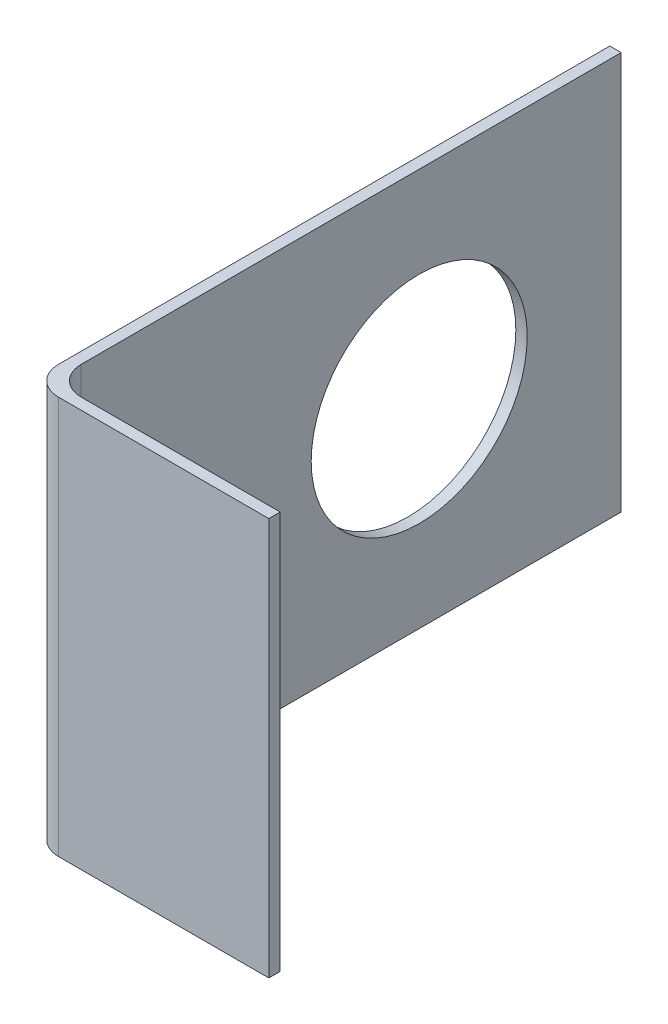
ISO-10303-21;
HEADER;
FILE_DESCRIPTION(('STEP AP214'),'2;1');
FILE_NAME('part.step','',(''),(''),'','','');
FILE_SCHEMA(('AUTOMOTIVE_DESIGN { 1 0 10303 214 1 1 1 1 }'));
ENDSEC;
DATA;
#1=APPLICATION_CONTEXT('core data for automotive mechanical design processes');
#2=APPLICATION_PROTOCOL_DEFINITION('international standard','automotive_design',2000,#1);
#3=PRODUCT_CONTEXT('',#1,'mechanical');
#4=PRODUCT('Part','Part','',(#3));
#5=PRODUCT_RELATED_PRODUCT_CATEGORY('part','',(#4));
#6=PRODUCT_DEFINITION_FORMATION('','',#4);
#7=PRODUCT_DEFINITION_CONTEXT('part definition',#1,'design');
#8=PRODUCT_DEFINITION('design','',#6,#7);
#9=PRODUCT_DEFINITION_SHAPE('','',#8);
#10=(LENGTH_UNIT() NAMED_UNIT(*) SI_UNIT(.MILLI.,.METRE.));
#11=(NAMED_UNIT(*) PLANE_ANGLE_UNIT() SI_UNIT($,.RADIAN.));
#12=(NAMED_UNIT(*) SI_UNIT($,.STERADIAN.) SOLID_ANGLE_UNIT());
#13=UNCERTAINTY_MEASURE_WITH_UNIT(LENGTH_MEASURE(1.E-05),#10,'distance_accuracy_value','');
#14=(GEOMETRIC_REPRESENTATION_CONTEXT(3) GLOBAL_UNCERTAINTY_ASSIGNED_CONTEXT((#13)) GLOBAL_UNIT_ASSIGNED_CONTEXT((#10,
#11,#12)) REPRESENTATION_CONTEXT('',''));
#15=CARTESIAN_POINT('',(0.,0.,0.));
#16=DIRECTION('',(0.,0.,1.));
#17=DIRECTION('',(1.,0.,0.));
#18=AXIS2_PLACEMENT_3D('',#15,#16,#17);
#19=CARTESIAN_POINT('',(-37.2906864976982,70.,70.6439393939394));
#20=DIRECTION('',(1.,0.,0.));
#21=DIRECTION('',(0.,0.,-1.));
#22=AXIS2_PLACEMENT_3D('',#19,#20,#21);
#23=PLANE('',#22);
#24=CARTESIAN_POINT('',(-37.2906864976982,35.,4.18393939393937));
#25=DIRECTION('',(-1.,0.,0.));
#26=DIRECTION('',(0.,0.,1.));
#27=AXIS2_PLACEMENT_3D('',#24,#25,#26);
#28=CIRCLE('',#27,19.);
#29=CARTESIAN_POINT('',(-37.2906864976982,35.,23.1839393939394));
#30=VERTEX_POINT('',#29);
#31=EDGE_CURVE('E153',#30,#30,#28,.T.);
#32=ORIENTED_EDGE('',*,*,#31,.F.);
#33=EDGE_LOOP('',(#32));
#34=FACE_BOUND('',#33,.T.);
#35=DIRECTION('',(0.,0.,1.));
#36=VECTOR('',#35,1.);
#37=CARTESIAN_POINT('',(-37.2906864976982,0.,70.6439393939394));
#38=LINE('',#37,#36);
#39=CARTESIAN_POINT('',(-37.2906864976982,0.,-31.3560606060606));
#40=VERTEX_POINT('',#39);
#41=CARTESIAN_POINT('',(-37.2906864976982,0.,65.6439393939394));
#42=VERTEX_POINT('',#41);
#43=EDGE_CURVE('E132',#40,#42,#38,.T.);
#44=ORIENTED_EDGE('',*,*,#43,.T.);
#45=DIRECTION('',(0.,-1.,0.));
#46=VECTOR('',#45,1.);
#47=CARTESIAN_POINT('',(-37.2906864976982,70.,65.6439393939394));
#48=LINE('',#47,#46);
#49=CARTESIAN_POINT('',(-37.2906864976982,70.,65.6439393939394));
#50=VERTEX_POINT('',#49);
#51=EDGE_CURVE('E157',#42,#50,#48,.F.);
#52=ORIENTED_EDGE('',*,*,#51,.T.);
#53=DIRECTION('',(0.,0.,1.));
#54=VECTOR('',#53,1.);
#55=CARTESIAN_POINT('',(-37.2906864976982,70.,70.6439393939394));
#56=LINE('',#55,#54);
#57=CARTESIAN_POINT('',(-37.2906864976982,70.,-31.3560606060606));
#58=VERTEX_POINT('',#57);
#59=EDGE_CURVE('E108',#58,#50,#56,.T.);
#60=ORIENTED_EDGE('',*,*,#59,.F.);
#61=DIRECTION('',(0.,-1.,0.));
#62=VECTOR('',#61,1.);
#63=CARTESIAN_POINT('',(-37.2906864976982,70.,-31.3560606060606));
#64=LINE('',#63,#62);
#65=EDGE_CURVE('E131',#58,#40,#64,.T.);
#66=ORIENTED_EDGE('',*,*,#65,.T.);
#67=EDGE_LOOP('',(#44,#52,#60,#66));
#68=FACE_BOUND('',#67,.T.);
#69=ADVANCED_FACE('F33',(#34,#68),#23,.F.);
#70=CARTESIAN_POINT('',(4.70931350230181,70.,70.6439393939394));
#71=DIRECTION('',(0.,0.,-1.));
#72=DIRECTION('',(-1.,0.,0.));
#73=AXIS2_PLACEMENT_3D('',#70,#71,#72);
#74=PLANE('',#73);
#75=DIRECTION('',(1.,0.,0.));
#76=VECTOR('',#75,1.);
#77=CARTESIAN_POINT('',(4.70931350230181,70.,70.6439393939394));
#78=LINE('',#77,#76);
#79=CARTESIAN_POINT('',(-32.2906864976982,70.,70.6439393939394));
#80=VERTEX_POINT('',#79);
#81=CARTESIAN_POINT('',(4.70931350230181,70.,70.6439393939394));
#82=VERTEX_POINT('',#81);
#83=EDGE_CURVE('E96',#80,#82,#78,.T.);
#84=ORIENTED_EDGE('',*,*,#83,.F.);
#85=DIRECTION('',(0.,-1.,0.));
#86=VECTOR('',#85,1.);
#87=CARTESIAN_POINT('',(-32.2906864976982,70.,70.6439393939394));
#88=LINE('',#87,#86);
#89=CARTESIAN_POINT('',(-32.2906864976982,0.,70.6439393939394));
#90=VERTEX_POINT('',#89);
#91=EDGE_CURVE('E117',#80,#90,#88,.T.);
#92=ORIENTED_EDGE('',*,*,#91,.T.);
#93=DIRECTION('',(1.,0.,0.));
#94=VECTOR('',#93,1.);
#95=CARTESIAN_POINT('',(4.70931350230181,0.,70.6439393939394));
#96=LINE('',#95,#94);
#97=CARTESIAN_POINT('',(4.70931350230181,0.,70.6439393939394));
#98=VERTEX_POINT('',#97);
#99=EDGE_CURVE('E114',#90,#98,#96,.T.);
#100=ORIENTED_EDGE('',*,*,#99,.T.);
#101=DIRECTION('',(0.,-1.,0.));
#102=VECTOR('',#101,1.);
#103=CARTESIAN_POINT('',(4.70931350230181,70.,70.6439393939394));
#104=LINE('',#103,#102);
#105=EDGE_CURVE('E111',#82,#98,#104,.T.);
#106=ORIENTED_EDGE('',*,*,#105,.F.);
#107=EDGE_LOOP('',(#84,#92,#100,#106));
#108=FACE_BOUND('',#107,.T.);
#109=ADVANCED_FACE('F112',(#108),#74,.F.);
#110=CARTESIAN_POINT('',(4.70931350230182,70.,68.6439393939394));
#111=DIRECTION('',(-1.,0.,0.));
#112=DIRECTION('',(0.,0.,1.));
#113=AXIS2_PLACEMENT_3D('',#110,#111,#112);
#114=PLANE('',#113);
#115=DIRECTION('',(0.,0.,-1.));
#116=VECTOR('',#115,1.);
#117=CARTESIAN_POINT('',(4.70931350230182,0.,68.6439393939394));
#118=LINE('',#117,#116);
#119=CARTESIAN_POINT('',(4.70931350230182,0.,68.6439393939394));
#120=VERTEX_POINT('',#119);
#121=EDGE_CURVE('E137',#98,#120,#118,.T.);
#122=ORIENTED_EDGE('',*,*,#121,.T.);
#123=DIRECTION('',(0.,-1.,0.));
#124=VECTOR('',#123,1.);
#125=CARTESIAN_POINT('',(4.70931350230182,70.,68.6439393939394));
#126=LINE('',#125,#124);
#127=CARTESIAN_POINT('',(4.70931350230182,70.,68.6439393939394));
#128=VERTEX_POINT('',#127);
#129=EDGE_CURVE('E118',#128,#120,#126,.T.);
#130=ORIENTED_EDGE('',*,*,#129,.F.);
#131=DIRECTION('',(0.,0.,-1.));
#132=VECTOR('',#131,1.);
#133=CARTESIAN_POINT('',(4.70931350230182,70.,68.6439393939394));
#134=LINE('',#133,#132);
#135=EDGE_CURVE('E101',#82,#128,#134,.T.);
#136=ORIENTED_EDGE('',*,*,#135,.F.);
#137=ORIENTED_EDGE('',*,*,#105,.T.);
#138=EDGE_LOOP('',(#122,#130,#136,#137));
#139=FACE_BOUND('',#138,.T.);
#140=ADVANCED_FACE('F120',(#139),#114,.F.);
#141=CARTESIAN_POINT('',(-35.2906864976982,70.,68.6439393939394));
#142=DIRECTION('',(0.,0.,1.));
#143=DIRECTION('',(1.,0.,0.));
#144=AXIS2_PLACEMENT_3D('',#141,#142,#143);
#145=PLANE('',#144);
#146=DIRECTION('',(-1.,0.,0.));
#147=VECTOR('',#146,1.);
#148=CARTESIAN_POINT('',(-35.2906864976982,0.,68.6439393939394));
#149=LINE('',#148,#147);
#150=CARTESIAN_POINT('',(-30.2906864976982,0.,68.6439393939394));
#151=VERTEX_POINT('',#150);
#152=EDGE_CURVE('E139',#120,#151,#149,.T.);
#153=ORIENTED_EDGE('',*,*,#152,.T.);
#154=DIRECTION('',(0.,-1.,0.));
#155=VECTOR('',#154,1.);
#156=CARTESIAN_POINT('',(-30.2906864976982,70.,68.6439393939394));
#157=LINE('',#156,#155);
#158=CARTESIAN_POINT('',(-30.2906864976982,70.,68.6439393939394));
#159=VERTEX_POINT('',#158);
#160=EDGE_CURVE('E54',#151,#159,#157,.F.);
#161=ORIENTED_EDGE('',*,*,#160,.T.);
#162=DIRECTION('',(-1.,0.,0.));
#163=VECTOR('',#162,1.);
#164=CARTESIAN_POINT('',(-35.2906864976982,70.,68.6439393939394));
#165=LINE('',#164,#163);
#166=EDGE_CURVE('E122',#128,#159,#165,.T.);
#167=ORIENTED_EDGE('',*,*,#166,.F.);
#168=ORIENTED_EDGE('',*,*,#129,.T.);
#169=EDGE_LOOP('',(#153,#161,#167,#168));
#170=FACE_BOUND('',#169,.T.);
#171=ADVANCED_FACE('F170',(#170),#145,.F.);
#172=CARTESIAN_POINT('',(-35.2906864976982,70.,-31.3560606060606));
#173=DIRECTION('',(-1.,0.,0.));
#174=DIRECTION('',(0.,0.,1.));
#175=AXIS2_PLACEMENT_3D('',#172,#173,#174);
#176=PLANE('',#175);
#177=CARTESIAN_POINT('',(-35.2906864976982,35.,4.18393939393937));
#178=DIRECTION('',(-1.,0.,0.));
#179=DIRECTION('',(0.,0.,1.));
#180=AXIS2_PLACEMENT_3D('',#177,#178,#179);
#181=CIRCLE('',#180,19.);
#182=CARTESIAN_POINT('',(-35.2906864976982,35.,23.1839393939394));
#183=VERTEX_POINT('',#182);
#184=EDGE_CURVE('E135',#183,#183,#181,.T.);
#185=ORIENTED_EDGE('',*,*,#184,.T.);
#186=EDGE_LOOP('',(#185));
#187=FACE_BOUND('',#186,.T.);
#188=DIRECTION('',(0.,0.,-1.));
#189=VECTOR('',#188,1.);
#190=CARTESIAN_POINT('',(-35.2906864976982,70.,-31.3560606060606));
#191=LINE('',#190,#189);
#192=CARTESIAN_POINT('',(-35.2906864976982,70.,63.6439393939394));
#193=VERTEX_POINT('',#192);
#194=CARTESIAN_POINT('',(-35.2906864976982,70.,-31.3560606060606));
#195=VERTEX_POINT('',#194);
#196=EDGE_CURVE('E124',#193,#195,#191,.T.);
#197=ORIENTED_EDGE('',*,*,#196,.F.);
#198=DIRECTION('',(0.,-1.,0.));
#199=VECTOR('',#198,1.);
#200=CARTESIAN_POINT('',(-35.2906864976982,0.,63.6439393939394));
#201=LINE('',#200,#199);
#202=CARTESIAN_POINT('',(-35.2906864976982,0.,63.6439393939394));
#203=VERTEX_POINT('',#202);
#204=EDGE_CURVE('E160',#193,#203,#201,.T.);
#205=ORIENTED_EDGE('',*,*,#204,.T.);
#206=DIRECTION('',(0.,0.,-1.));
#207=VECTOR('',#206,1.);
#208=CARTESIAN_POINT('',(-35.2906864976982,0.,-31.3560606060606));
#209=LINE('',#208,#207);
#210=CARTESIAN_POINT('',(-35.2906864976982,0.,-31.3560606060606));
#211=VERTEX_POINT('',#210);
#212=EDGE_CURVE('E141',#203,#211,#209,.T.);
#213=ORIENTED_EDGE('',*,*,#212,.T.);
#214=DIRECTION('',(0.,-1.,0.));
#215=VECTOR('',#214,1.);
#216=CARTESIAN_POINT('',(-35.2906864976982,70.,-31.3560606060606));
#217=LINE('',#216,#215);
#218=EDGE_CURVE('E147',#195,#211,#217,.T.);
#219=ORIENTED_EDGE('',*,*,#218,.F.);
#220=EDGE_LOOP('',(#197,#205,#213,#219));
#221=FACE_BOUND('',#220,.T.);
#222=ADVANCED_FACE('F172',(#187,#221),#176,.F.);
#223=CARTESIAN_POINT('',(-37.2906864976982,70.,-31.3560606060606));
#224=DIRECTION('',(0.,0.,1.));
#225=DIRECTION('',(1.,0.,0.));
#226=AXIS2_PLACEMENT_3D('',#223,#224,#225);
#227=PLANE('',#226);
#228=DIRECTION('',(-1.,0.,0.));
#229=VECTOR('',#228,1.);
#230=CARTESIAN_POINT('',(-37.2906864976982,0.,-31.3560606060606));
#231=LINE('',#230,#229);
#232=EDGE_CURVE('E143',#211,#40,#231,.T.);
#233=ORIENTED_EDGE('',*,*,#232,.T.);
#234=ORIENTED_EDGE('',*,*,#65,.F.);
#235=DIRECTION('',(-1.,0.,0.));
#236=VECTOR('',#235,1.);
#237=CARTESIAN_POINT('',(-37.2906864976982,70.,-31.3560606060606));
#238=LINE('',#237,#236);
#239=EDGE_CURVE('E129',#195,#58,#238,.T.);
#240=ORIENTED_EDGE('',*,*,#239,.F.);
#241=ORIENTED_EDGE('',*,*,#218,.T.);
#242=EDGE_LOOP('',(#233,#234,#240,#241));
#243=FACE_BOUND('',#242,.T.);
#244=ADVANCED_FACE('F178',(#243),#227,.F.);
#245=CARTESIAN_POINT('',(0.,70.,0.));
#246=DIRECTION('',(0.,-1.,0.));
#247=DIRECTION('',(0.,0.,-1.));
#248=AXIS2_PLACEMENT_3D('',#245,#246,#247);
#249=PLANE('',#248);
#250=ORIENTED_EDGE('',*,*,#59,.T.);
#251=CARTESIAN_POINT('',(-32.2906864976982,70.,65.6439393939394));
#252=DIRECTION('',(0.,-1.,0.));
#253=DIRECTION('',(0.,0.,-1.));
#254=AXIS2_PLACEMENT_3D('',#251,#252,#253);
#255=CIRCLE('',#254,5.);
#256=EDGE_CURVE('E104',#50,#80,#255,.F.);
#257=ORIENTED_EDGE('',*,*,#256,.T.);
#258=ORIENTED_EDGE('',*,*,#83,.T.);
#259=ORIENTED_EDGE('',*,*,#135,.T.);
#260=ORIENTED_EDGE('',*,*,#166,.T.);
#261=CARTESIAN_POINT('',(-30.2906864976982,70.,63.6439393939394));
#262=DIRECTION('',(0.,-1.,0.));
#263=DIRECTION('',(0.,0.,-1.));
#264=AXIS2_PLACEMENT_3D('',#261,#262,#263);
#265=CIRCLE('',#264,5.);
#266=EDGE_CURVE('E11',#159,#193,#265,.T.);
#267=ORIENTED_EDGE('',*,*,#266,.T.);
#268=ORIENTED_EDGE('',*,*,#196,.T.);
#269=ORIENTED_EDGE('',*,*,#239,.T.);
#270=EDGE_LOOP('',(#250,#257,#258,#259,#260,#267,#268,#269));
#271=FACE_BOUND('',#270,.T.);
#272=ADVANCED_FACE('F99',(#271),#249,.F.);
#273=CARTESIAN_POINT('',(0.,0.,0.));
#274=DIRECTION('',(0.,-1.,0.));
#275=DIRECTION('',(0.,0.,-1.));
#276=AXIS2_PLACEMENT_3D('',#273,#274,#275);
#277=PLANE('',#276);
#278=ORIENTED_EDGE('',*,*,#99,.F.);
#279=CARTESIAN_POINT('',(-32.2906864976982,0.,65.6439393939394));
#280=DIRECTION('',(0.,-1.,0.));
#281=DIRECTION('',(0.,0.,-1.));
#282=AXIS2_PLACEMENT_3D('',#279,#280,#281);
#283=CIRCLE('',#282,5.);
#284=EDGE_CURVE('E155',#90,#42,#283,.T.);
#285=ORIENTED_EDGE('',*,*,#284,.T.);
#286=ORIENTED_EDGE('',*,*,#43,.F.);
#287=ORIENTED_EDGE('',*,*,#232,.F.);
#288=ORIENTED_EDGE('',*,*,#212,.F.);
#289=CARTESIAN_POINT('',(-30.2906864976982,0.,63.6439393939394));
#290=DIRECTION('',(0.,-1.,0.));
#291=DIRECTION('',(0.,0.,-1.));
#292=AXIS2_PLACEMENT_3D('',#289,#290,#291);
#293=CIRCLE('',#292,5.);
#294=EDGE_CURVE('E41',#203,#151,#293,.F.);
#295=ORIENTED_EDGE('',*,*,#294,.T.);
#296=ORIENTED_EDGE('',*,*,#152,.F.);
#297=ORIENTED_EDGE('',*,*,#121,.F.);
#298=EDGE_LOOP('',(#278,#285,#286,#287,#288,#295,#296,#297));
#299=FACE_BOUND('',#298,.T.);
#300=ADVANCED_FACE('F166',(#299),#277,.T.);
#301=CARTESIAN_POINT('',(4.70931350230182,35.,4.18393939393937));
#302=DIRECTION('',(-1.,0.,0.));
#303=DIRECTION('',(0.,0.,1.));
#304=AXIS2_PLACEMENT_3D('',#301,#302,#303);
#305=CYLINDRICAL_SURFACE('',#304,19.);
#306=ORIENTED_EDGE('',*,*,#31,.T.);
#307=EDGE_LOOP('',(#306));
#308=FACE_BOUND('',#307,.T.);
#309=ORIENTED_EDGE('',*,*,#184,.F.);
#310=EDGE_LOOP('',(#309));
#311=FACE_BOUND('',#310,.T.);
#312=ADVANCED_FACE('F186',(#308,#311),#305,.F.);
#313=CARTESIAN_POINT('',(-32.2906864976982,70.,65.6439393939394));
#314=DIRECTION('',(0.,-1.,0.));
#315=DIRECTION('',(0.,0.,-1.));
#316=AXIS2_PLACEMENT_3D('',#313,#314,#315);
#317=CYLINDRICAL_SURFACE('',#316,5.);
#318=ORIENTED_EDGE('',*,*,#256,.F.);
#319=ORIENTED_EDGE('',*,*,#51,.F.);
#320=ORIENTED_EDGE('',*,*,#284,.F.);
#321=ORIENTED_EDGE('',*,*,#91,.F.);
#322=EDGE_LOOP('',(#318,#319,#320,#321));
#323=FACE_BOUND('',#322,.T.);
#324=ADVANCED_FACE('F196',(#323),#317,.T.);
#325=CARTESIAN_POINT('',(-30.2906864976982,70.,63.6439393939394));
#326=DIRECTION('',(0.,1.,0.));
#327=DIRECTION('',(0.,0.,1.));
#328=AXIS2_PLACEMENT_3D('',#325,#326,#327);
#329=CYLINDRICAL_SURFACE('',#328,5.);
#330=ORIENTED_EDGE('',*,*,#266,.F.);
#331=ORIENTED_EDGE('',*,*,#160,.F.);
#332=ORIENTED_EDGE('',*,*,#294,.F.);
#333=ORIENTED_EDGE('',*,*,#204,.F.);
#334=EDGE_LOOP('',(#330,#331,#332,#333));
#335=FACE_BOUND('',#334,.T.);
#336=ADVANCED_FACE('F35',(#335),#329,.F.);
#337=CLOSED_SHELL('',(#69,#109,#140,#171,#222,#244,#272,#300,#312,#324,#336));
#338=MANIFOLD_SOLID_BREP('B2',#337);
#339=ADVANCED_BREP_SHAPE_REPRESENTATION('',(#18,#338),#14);
#340=SHAPE_DEFINITION_REPRESENTATION(#9,#339);
ENDSEC;
END-ISO-10303-21;
